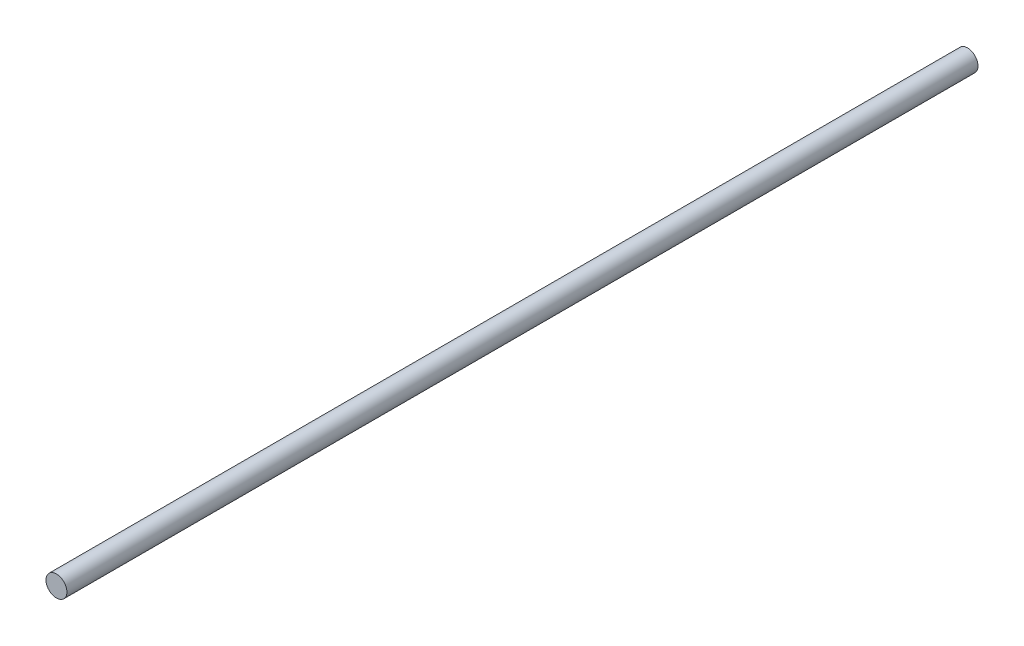
ISO-10303-21;
HEADER;
FILE_DESCRIPTION(('STEP AP214'),'2;1');
FILE_NAME('part.step','',(''),(''),'','','');
FILE_SCHEMA(('AUTOMOTIVE_DESIGN { 1 0 10303 214 1 1 1 1 }'));
ENDSEC;
DATA;
#1=APPLICATION_CONTEXT('core data for automotive mechanical design processes');
#2=APPLICATION_PROTOCOL_DEFINITION('international standard','automotive_design',2000,#1);
#3=PRODUCT_CONTEXT('',#1,'mechanical');
#4=PRODUCT('Part','Part','',(#3));
#5=PRODUCT_RELATED_PRODUCT_CATEGORY('part','',(#4));
#6=PRODUCT_DEFINITION_FORMATION('','',#4);
#7=PRODUCT_DEFINITION_CONTEXT('part definition',#1,'design');
#8=PRODUCT_DEFINITION('design','',#6,#7);
#9=PRODUCT_DEFINITION_SHAPE('','',#8);
#10=(LENGTH_UNIT() NAMED_UNIT(*) SI_UNIT(.MILLI.,.METRE.));
#11=(NAMED_UNIT(*) PLANE_ANGLE_UNIT() SI_UNIT($,.RADIAN.));
#12=(NAMED_UNIT(*) SI_UNIT($,.STERADIAN.) SOLID_ANGLE_UNIT());
#13=UNCERTAINTY_MEASURE_WITH_UNIT(LENGTH_MEASURE(1.E-05),#10,'distance_accuracy_value','');
#14=(GEOMETRIC_REPRESENTATION_CONTEXT(3) GLOBAL_UNCERTAINTY_ASSIGNED_CONTEXT((#13)) GLOBAL_UNIT_ASSIGNED_CONTEXT((#10,
#11,#12)) REPRESENTATION_CONTEXT('',''));
#15=CARTESIAN_POINT('',(0.,0.,0.));
#16=DIRECTION('',(0.,0.,1.));
#17=DIRECTION('',(1.,0.,0.));
#18=AXIS2_PLACEMENT_3D('',#15,#16,#17);
#19=CARTESIAN_POINT('',(0.,0.,261.25));
#20=DIRECTION('',(0.,0.,-1.));
#21=DIRECTION('',(-1.,0.,0.));
#22=AXIS2_PLACEMENT_3D('',#19,#20,#21);
#23=CYLINDRICAL_SURFACE('',#22,6.);
#24=CARTESIAN_POINT('',(0.,0.,261.25));
#25=DIRECTION('',(0.,0.,1.));
#26=DIRECTION('',(1.,0.,0.));
#27=AXIS2_PLACEMENT_3D('',#24,#25,#26);
#28=CIRCLE('',#27,6.);
#29=CARTESIAN_POINT('',(6.,0.,261.25));
#30=VERTEX_POINT('',#29);
#31=EDGE_CURVE('E10',#30,#30,#28,.T.);
#32=ORIENTED_EDGE('',*,*,#31,.F.);
#33=EDGE_LOOP('',(#32));
#34=FACE_BOUND('',#33,.T.);
#35=CARTESIAN_POINT('',(0.,0.,-261.25));
#36=DIRECTION('',(0.,0.,1.));
#37=DIRECTION('',(1.,0.,0.));
#38=AXIS2_PLACEMENT_3D('',#35,#36,#37);
#39=CIRCLE('',#38,6.);
#40=CARTESIAN_POINT('',(6.,0.,-261.25));
#41=VERTEX_POINT('',#40);
#42=EDGE_CURVE('E37',#41,#41,#39,.T.);
#43=ORIENTED_EDGE('',*,*,#42,.T.);
#44=EDGE_LOOP('',(#43));
#45=FACE_BOUND('',#44,.T.);
#46=ADVANCED_FACE('F34',(#34,#45),#23,.T.);
#47=CARTESIAN_POINT('',(0.,0.,261.25));
#48=DIRECTION('',(0.,0.,1.));
#49=DIRECTION('',(1.,0.,0.));
#50=AXIS2_PLACEMENT_3D('',#47,#48,#49);
#51=PLANE('',#50);
#52=ORIENTED_EDGE('',*,*,#31,.T.);
#53=EDGE_LOOP('',(#52));
#54=FACE_BOUND('',#53,.T.);
#55=ADVANCED_FACE('F49',(#54),#51,.T.);
#56=CARTESIAN_POINT('',(0.,0.,-261.25));
#57=DIRECTION('',(0.,0.,1.));
#58=DIRECTION('',(1.,0.,0.));
#59=AXIS2_PLACEMENT_3D('',#56,#57,#58);
#60=PLANE('',#59);
#61=ORIENTED_EDGE('',*,*,#42,.F.);
#62=EDGE_LOOP('',(#61));
#63=FACE_BOUND('',#62,.T.);
#64=ADVANCED_FACE('F47',(#63),#60,.F.);
#65=CLOSED_SHELL('',(#46,#55,#64));
#66=MANIFOLD_SOLID_BREP('B2',#65);
#67=ADVANCED_BREP_SHAPE_REPRESENTATION('',(#18,#66),#14);
#68=SHAPE_DEFINITION_REPRESENTATION(#9,#67);
ENDSEC;
END-ISO-10303-21;
